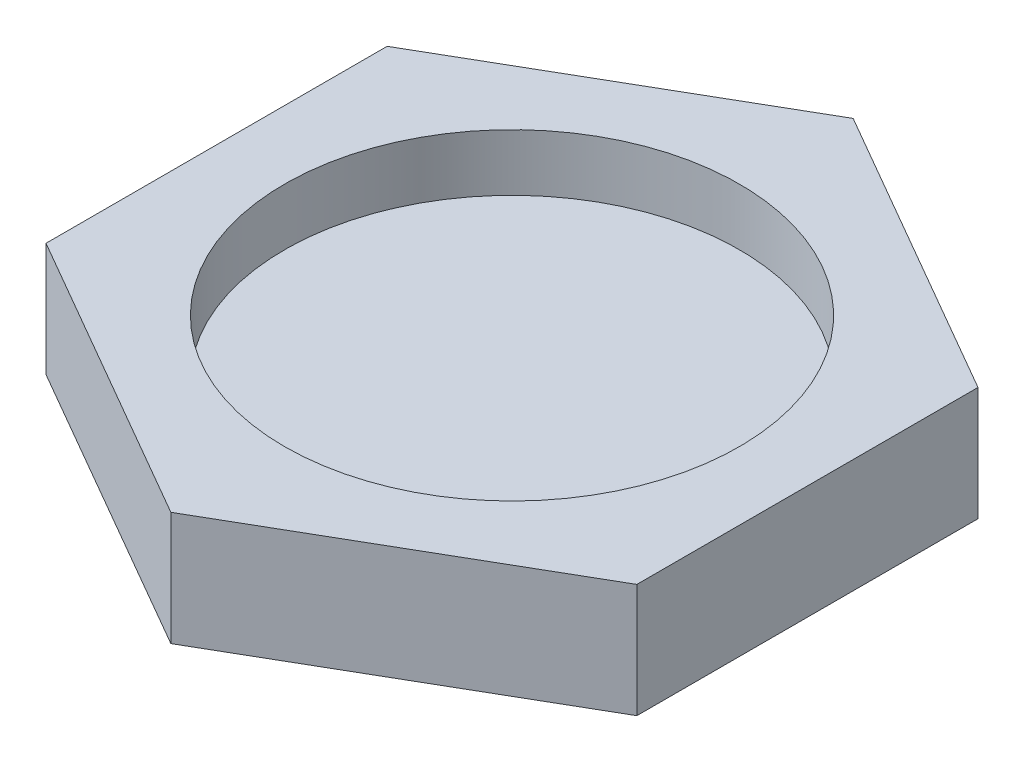
ISO-10303-21;
HEADER;
FILE_DESCRIPTION(('STEP AP214'),'2;1');
FILE_NAME('part.step','',(''),(''),'','','');
FILE_SCHEMA(('AUTOMOTIVE_DESIGN { 1 0 10303 214 1 1 1 1 }'));
ENDSEC;
DATA;
#1=APPLICATION_CONTEXT('core data for automotive mechanical design processes');
#2=APPLICATION_PROTOCOL_DEFINITION('international standard','automotive_design',2000,#1);
#3=PRODUCT_CONTEXT('',#1,'mechanical');
#4=PRODUCT('Part','Part','',(#3));
#5=PRODUCT_RELATED_PRODUCT_CATEGORY('part','',(#4));
#6=PRODUCT_DEFINITION_FORMATION('','',#4);
#7=PRODUCT_DEFINITION_CONTEXT('part definition',#1,'design');
#8=PRODUCT_DEFINITION('design','',#6,#7);
#9=PRODUCT_DEFINITION_SHAPE('','',#8);
#10=(LENGTH_UNIT() NAMED_UNIT(*) SI_UNIT(.MILLI.,.METRE.));
#11=(NAMED_UNIT(*) PLANE_ANGLE_UNIT() SI_UNIT($,.RADIAN.));
#12=(NAMED_UNIT(*) SI_UNIT($,.STERADIAN.) SOLID_ANGLE_UNIT());
#13=UNCERTAINTY_MEASURE_WITH_UNIT(LENGTH_MEASURE(1.E-05),#10,'distance_accuracy_value','');
#14=(GEOMETRIC_REPRESENTATION_CONTEXT(3) GLOBAL_UNCERTAINTY_ASSIGNED_CONTEXT((#13)) GLOBAL_UNIT_ASSIGNED_CONTEXT((#10,
#11,#12)) REPRESENTATION_CONTEXT('',''));
#15=CARTESIAN_POINT('',(0.,0.,0.));
#16=DIRECTION('',(0.,0.,1.));
#17=DIRECTION('',(1.,0.,0.));
#18=AXIS2_PLACEMENT_3D('',#15,#16,#17);
#19=CARTESIAN_POINT('',(131.982271536748,50.8,-76.2));
#20=DIRECTION('',(-0.5,0.,0.866025403784439));
#21=DIRECTION('',(0.866025403784439,0.,0.5));
#22=AXIS2_PLACEMENT_3D('',#19,#20,#21);
#23=PLANE('',#22);
#24=DIRECTION('',(-0.866025403784439,0.,-0.5));
#25=VECTOR('',#24,1.);
#26=CARTESIAN_POINT('',(131.982271536748,0.,-76.2));
#27=LINE('',#26,#25);
#28=CARTESIAN_POINT('',(131.982271536748,0.,-76.2));
#29=VERTEX_POINT('',#28);
#30=CARTESIAN_POINT('',(0.,0.,-152.4));
#31=VERTEX_POINT('',#30);
#32=EDGE_CURVE('E117',#29,#31,#27,.T.);
#33=ORIENTED_EDGE('',*,*,#32,.T.);
#34=DIRECTION('',(0.,-1.,0.));
#35=VECTOR('',#34,1.);
#36=CARTESIAN_POINT('',(0.,50.8,-152.4));
#37=LINE('',#36,#35);
#38=CARTESIAN_POINT('',(0.,50.8,-152.4));
#39=VERTEX_POINT('',#38);
#40=EDGE_CURVE('E11',#39,#31,#37,.T.);
#41=ORIENTED_EDGE('',*,*,#40,.F.);
#42=DIRECTION('',(-0.866025403784439,0.,-0.5));
#43=VECTOR('',#42,1.);
#44=CARTESIAN_POINT('',(131.982271536748,50.8,-76.2));
#45=LINE('',#44,#43);
#46=CARTESIAN_POINT('',(131.982271536748,50.8,-76.2));
#47=VERTEX_POINT('',#46);
#48=EDGE_CURVE('E128',#47,#39,#45,.T.);
#49=ORIENTED_EDGE('',*,*,#48,.F.);
#50=DIRECTION('',(0.,-1.,0.));
#51=VECTOR('',#50,1.);
#52=CARTESIAN_POINT('',(131.982271536748,50.8,-76.2));
#53=LINE('',#52,#51);
#54=EDGE_CURVE('E113',#47,#29,#53,.T.);
#55=ORIENTED_EDGE('',*,*,#54,.T.);
#56=EDGE_LOOP('',(#33,#41,#49,#55));
#57=FACE_BOUND('',#56,.T.);
#58=ADVANCED_FACE('F33',(#57),#23,.F.);
#59=CARTESIAN_POINT('',(0.,50.8,-152.4));
#60=DIRECTION('',(0.5,0.,0.866025403784439));
#61=DIRECTION('',(0.866025403784439,0.,-0.5));
#62=AXIS2_PLACEMENT_3D('',#59,#60,#61);
#63=PLANE('',#62);
#64=DIRECTION('',(-0.866025403784439,0.,0.5));
#65=VECTOR('',#64,1.);
#66=CARTESIAN_POINT('',(0.,0.,-152.4));
#67=LINE('',#66,#65);
#68=CARTESIAN_POINT('',(-131.982271536748,0.,-76.2));
#69=VERTEX_POINT('',#68);
#70=EDGE_CURVE('E120',#31,#69,#67,.T.);
#71=ORIENTED_EDGE('',*,*,#70,.T.);
#72=DIRECTION('',(0.,-1.,0.));
#73=VECTOR('',#72,1.);
#74=CARTESIAN_POINT('',(-131.982271536748,50.8,-76.2));
#75=LINE('',#74,#73);
#76=CARTESIAN_POINT('',(-131.982271536748,50.8,-76.2));
#77=VERTEX_POINT('',#76);
#78=EDGE_CURVE('E41',#77,#69,#75,.T.);
#79=ORIENTED_EDGE('',*,*,#78,.F.);
#80=DIRECTION('',(-0.866025403784439,0.,0.5));
#81=VECTOR('',#80,1.);
#82=CARTESIAN_POINT('',(0.,50.8,-152.4));
#83=LINE('',#82,#81);
#84=EDGE_CURVE('E86',#39,#77,#83,.T.);
#85=ORIENTED_EDGE('',*,*,#84,.F.);
#86=ORIENTED_EDGE('',*,*,#40,.T.);
#87=EDGE_LOOP('',(#71,#79,#85,#86));
#88=FACE_BOUND('',#87,.T.);
#89=ADVANCED_FACE('F153',(#88),#63,.F.);
#90=CARTESIAN_POINT('',(-131.982271536748,50.8,-76.2));
#91=DIRECTION('',(1.,0.,0.));
#92=DIRECTION('',(0.,0.,-1.));
#93=AXIS2_PLACEMENT_3D('',#90,#91,#92);
#94=PLANE('',#93);
#95=DIRECTION('',(0.,0.,1.));
#96=VECTOR('',#95,1.);
#97=CARTESIAN_POINT('',(-131.982271536748,0.,-76.2));
#98=LINE('',#97,#96);
#99=CARTESIAN_POINT('',(-131.982271536748,0.,76.2));
#100=VERTEX_POINT('',#99);
#101=EDGE_CURVE('E123',#69,#100,#98,.T.);
#102=ORIENTED_EDGE('',*,*,#101,.T.);
#103=DIRECTION('',(0.,-1.,0.));
#104=VECTOR('',#103,1.);
#105=CARTESIAN_POINT('',(-131.982271536748,50.8,76.2));
#106=LINE('',#105,#104);
#107=CARTESIAN_POINT('',(-131.982271536748,50.8,76.2));
#108=VERTEX_POINT('',#107);
#109=EDGE_CURVE('E108',#108,#100,#106,.T.);
#110=ORIENTED_EDGE('',*,*,#109,.F.);
#111=DIRECTION('',(0.,0.,1.));
#112=VECTOR('',#111,1.);
#113=CARTESIAN_POINT('',(-131.982271536748,50.8,-76.2));
#114=LINE('',#113,#112);
#115=EDGE_CURVE('E99',#77,#108,#114,.T.);
#116=ORIENTED_EDGE('',*,*,#115,.F.);
#117=ORIENTED_EDGE('',*,*,#78,.T.);
#118=EDGE_LOOP('',(#102,#110,#116,#117));
#119=FACE_BOUND('',#118,.T.);
#120=ADVANCED_FACE('F134',(#119),#94,.F.);
#121=CARTESIAN_POINT('',(-131.982271536748,50.8,76.2));
#122=DIRECTION('',(0.5,0.,-0.866025403784439));
#123=DIRECTION('',(-0.866025403784439,0.,-0.5));
#124=AXIS2_PLACEMENT_3D('',#121,#122,#123);
#125=PLANE('',#124);
#126=DIRECTION('',(0.866025403784439,0.,0.5));
#127=VECTOR('',#126,1.);
#128=CARTESIAN_POINT('',(-131.982271536748,0.,76.2));
#129=LINE('',#128,#127);
#130=CARTESIAN_POINT('',(0.,0.,152.4));
#131=VERTEX_POINT('',#130);
#132=EDGE_CURVE('E107',#100,#131,#129,.T.);
#133=ORIENTED_EDGE('',*,*,#132,.T.);
#134=DIRECTION('',(0.,-1.,0.));
#135=VECTOR('',#134,1.);
#136=CARTESIAN_POINT('',(0.,50.8,152.4));
#137=LINE('',#136,#135);
#138=CARTESIAN_POINT('',(0.,50.8,152.4));
#139=VERTEX_POINT('',#138);
#140=EDGE_CURVE('E104',#139,#131,#137,.T.);
#141=ORIENTED_EDGE('',*,*,#140,.F.);
#142=DIRECTION('',(0.866025403784439,0.,0.5));
#143=VECTOR('',#142,1.);
#144=CARTESIAN_POINT('',(-131.982271536748,50.8,76.2));
#145=LINE('',#144,#143);
#146=EDGE_CURVE('E93',#108,#139,#145,.T.);
#147=ORIENTED_EDGE('',*,*,#146,.F.);
#148=ORIENTED_EDGE('',*,*,#109,.T.);
#149=EDGE_LOOP('',(#133,#141,#147,#148));
#150=FACE_BOUND('',#149,.T.);
#151=ADVANCED_FACE('F105',(#150),#125,.F.);
#152=CARTESIAN_POINT('',(0.,50.8,152.4));
#153=DIRECTION('',(-0.5,0.,-0.866025403784439));
#154=DIRECTION('',(-0.866025403784439,0.,0.5));
#155=AXIS2_PLACEMENT_3D('',#152,#153,#154);
#156=PLANE('',#155);
#157=DIRECTION('',(0.866025403784439,0.,-0.5));
#158=VECTOR('',#157,1.);
#159=CARTESIAN_POINT('',(0.,0.,152.4));
#160=LINE('',#159,#158);
#161=CARTESIAN_POINT('',(131.982271536748,0.,76.2));
#162=VERTEX_POINT('',#161);
#163=EDGE_CURVE('E72',#131,#162,#160,.T.);
#164=ORIENTED_EDGE('',*,*,#163,.T.);
#165=DIRECTION('',(0.,-1.,0.));
#166=VECTOR('',#165,1.);
#167=CARTESIAN_POINT('',(131.982271536748,50.8,76.2));
#168=LINE('',#167,#166);
#169=CARTESIAN_POINT('',(131.982271536748,50.8,76.2));
#170=VERTEX_POINT('',#169);
#171=EDGE_CURVE('E109',#170,#162,#168,.T.);
#172=ORIENTED_EDGE('',*,*,#171,.F.);
#173=DIRECTION('',(0.866025403784439,0.,-0.5));
#174=VECTOR('',#173,1.);
#175=CARTESIAN_POINT('',(0.,50.8,152.4));
#176=LINE('',#175,#174);
#177=EDGE_CURVE('E97',#139,#170,#176,.T.);
#178=ORIENTED_EDGE('',*,*,#177,.F.);
#179=ORIENTED_EDGE('',*,*,#140,.T.);
#180=EDGE_LOOP('',(#164,#172,#178,#179));
#181=FACE_BOUND('',#180,.T.);
#182=ADVANCED_FACE('F111',(#181),#156,.F.);
#183=CARTESIAN_POINT('',(131.982271536748,50.8,76.2));
#184=DIRECTION('',(-1.,0.,0.));
#185=DIRECTION('',(0.,0.,1.));
#186=AXIS2_PLACEMENT_3D('',#183,#184,#185);
#187=PLANE('',#186);
#188=DIRECTION('',(0.,0.,-1.));
#189=VECTOR('',#188,1.);
#190=CARTESIAN_POINT('',(131.982271536748,0.,76.2));
#191=LINE('',#190,#189);
#192=EDGE_CURVE('E78',#162,#29,#191,.T.);
#193=ORIENTED_EDGE('',*,*,#192,.T.);
#194=ORIENTED_EDGE('',*,*,#54,.F.);
#195=DIRECTION('',(0.,0.,-1.));
#196=VECTOR('',#195,1.);
#197=CARTESIAN_POINT('',(131.982271536748,50.8,76.2));
#198=LINE('',#197,#196);
#199=EDGE_CURVE('E49',#170,#47,#198,.T.);
#200=ORIENTED_EDGE('',*,*,#199,.F.);
#201=ORIENTED_EDGE('',*,*,#171,.T.);
#202=EDGE_LOOP('',(#193,#194,#200,#201));
#203=FACE_BOUND('',#202,.T.);
#204=ADVANCED_FACE('F141',(#203),#187,.F.);
#205=CARTESIAN_POINT('',(0.,50.8,0.));
#206=DIRECTION('',(0.,1.,0.));
#207=DIRECTION('',(0.,0.,1.));
#208=AXIS2_PLACEMENT_3D('',#205,#206,#207);
#209=PLANE('',#208);
#210=CARTESIAN_POINT('',(0.,50.8,0.));
#211=DIRECTION('',(0.,1.,0.));
#212=DIRECTION('',(0.,0.,1.));
#213=AXIS2_PLACEMENT_3D('',#210,#211,#212);
#214=CIRCLE('',#213,101.6);
#215=CARTESIAN_POINT('',(0.,50.8,101.6));
#216=VERTEX_POINT('',#215);
#217=EDGE_CURVE('E214',#216,#216,#214,.T.);
#218=ORIENTED_EDGE('',*,*,#217,.F.);
#219=EDGE_LOOP('',(#218));
#220=FACE_BOUND('',#219,.T.);
#221=ORIENTED_EDGE('',*,*,#48,.T.);
#222=ORIENTED_EDGE('',*,*,#84,.T.);
#223=ORIENTED_EDGE('',*,*,#115,.T.);
#224=ORIENTED_EDGE('',*,*,#146,.T.);
#225=ORIENTED_EDGE('',*,*,#177,.T.);
#226=ORIENTED_EDGE('',*,*,#199,.T.);
#227=EDGE_LOOP('',(#221,#222,#223,#224,#225,#226));
#228=FACE_BOUND('',#227,.T.);
#229=ADVANCED_FACE('F95',(#220,#228),#209,.T.);
#230=CARTESIAN_POINT('',(0.,0.,0.));
#231=DIRECTION('',(0.,1.,0.));
#232=DIRECTION('',(0.,0.,1.));
#233=AXIS2_PLACEMENT_3D('',#230,#231,#232);
#234=PLANE('',#233);
#235=ORIENTED_EDGE('',*,*,#32,.F.);
#236=ORIENTED_EDGE('',*,*,#192,.F.);
#237=ORIENTED_EDGE('',*,*,#163,.F.);
#238=ORIENTED_EDGE('',*,*,#132,.F.);
#239=ORIENTED_EDGE('',*,*,#101,.F.);
#240=ORIENTED_EDGE('',*,*,#70,.F.);
#241=EDGE_LOOP('',(#235,#236,#237,#238,#239,#240));
#242=FACE_BOUND('',#241,.T.);
#243=ADVANCED_FACE('F137',(#242),#234,.F.);
#244=CARTESIAN_POINT('',(0.,25.4,0.));
#245=DIRECTION('',(0.,1.,0.));
#246=DIRECTION('',(0.,0.,1.));
#247=AXIS2_PLACEMENT_3D('',#244,#245,#246);
#248=CYLINDRICAL_SURFACE('',#247,101.6);
#249=CARTESIAN_POINT('',(0.,25.4,0.));
#250=DIRECTION('',(0.,1.,0.));
#251=DIRECTION('',(0.,0.,1.));
#252=AXIS2_PLACEMENT_3D('',#249,#250,#251);
#253=CIRCLE('',#252,101.6);
#254=CARTESIAN_POINT('',(0.,25.4,101.6));
#255=VERTEX_POINT('',#254);
#256=EDGE_CURVE('E121',#255,#255,#253,.T.);
#257=ORIENTED_EDGE('',*,*,#256,.F.);
#258=EDGE_LOOP('',(#257));
#259=FACE_BOUND('',#258,.T.);
#260=ORIENTED_EDGE('',*,*,#217,.T.);
#261=EDGE_LOOP('',(#260));
#262=FACE_BOUND('',#261,.T.);
#263=ADVANCED_FACE('F185',(#259,#262),#248,.F.);
#264=CARTESIAN_POINT('',(0.,25.4,0.));
#265=DIRECTION('',(0.,1.,0.));
#266=DIRECTION('',(0.,0.,1.));
#267=AXIS2_PLACEMENT_3D('',#264,#265,#266);
#268=PLANE('',#267);
#269=ORIENTED_EDGE('',*,*,#256,.T.);
#270=EDGE_LOOP('',(#269));
#271=FACE_BOUND('',#270,.T.);
#272=ADVANCED_FACE('F198',(#271),#268,.T.);
#273=CLOSED_SHELL('',(#58,#89,#120,#151,#182,#204,#229,#243,#263,#272));
#274=MANIFOLD_SOLID_BREP('B2',#273);
#275=ADVANCED_BREP_SHAPE_REPRESENTATION('',(#18,#274),#14);
#276=SHAPE_DEFINITION_REPRESENTATION(#9,#275);
ENDSEC;
END-ISO-10303-21;
